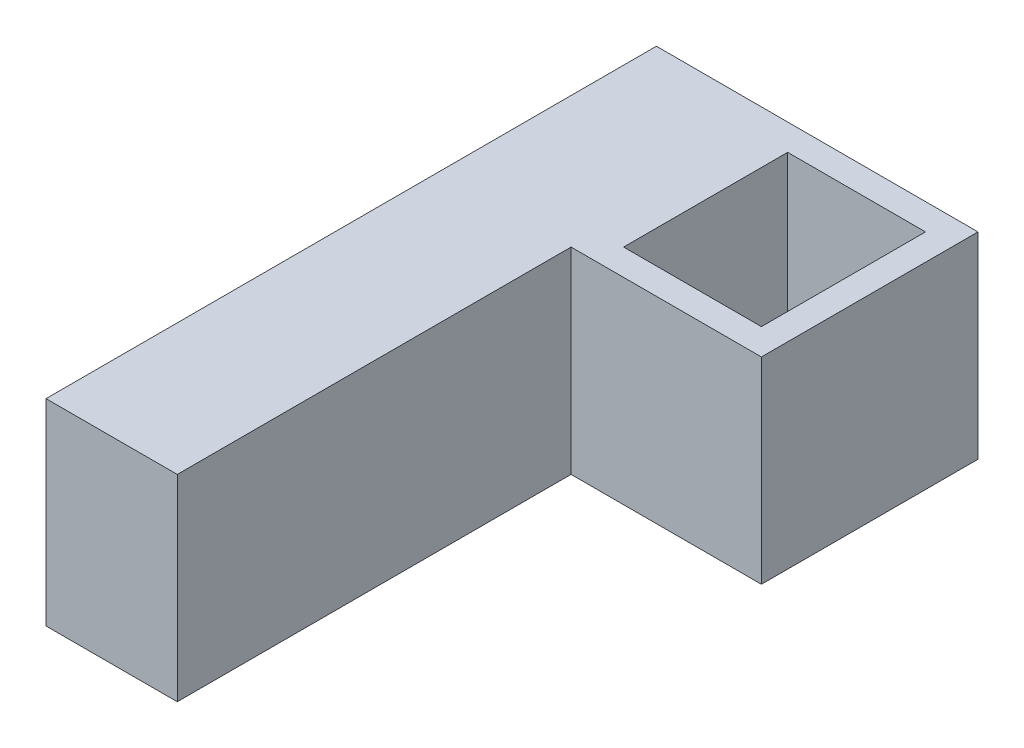
ISO-10303-21;
HEADER;
FILE_DESCRIPTION(('STEP AP214'),'2;1');
FILE_NAME('part.step','',(''),(''),'','','');
FILE_SCHEMA(('AUTOMOTIVE_DESIGN { 1 0 10303 214 1 1 1 1 }'));
ENDSEC;
DATA;
#1=APPLICATION_CONTEXT('core data for automotive mechanical design processes');
#2=APPLICATION_PROTOCOL_DEFINITION('international standard','automotive_design',2000,#1);
#3=PRODUCT_CONTEXT('',#1,'mechanical');
#4=PRODUCT('Part','Part','',(#3));
#5=PRODUCT_RELATED_PRODUCT_CATEGORY('part','',(#4));
#6=PRODUCT_DEFINITION_FORMATION('','',#4);
#7=PRODUCT_DEFINITION_CONTEXT('part definition',#1,'design');
#8=PRODUCT_DEFINITION('design','',#6,#7);
#9=PRODUCT_DEFINITION_SHAPE('','',#8);
#10=(LENGTH_UNIT() NAMED_UNIT(*) SI_UNIT(.MILLI.,.METRE.));
#11=(NAMED_UNIT(*) PLANE_ANGLE_UNIT() SI_UNIT($,.RADIAN.));
#12=(NAMED_UNIT(*) SI_UNIT($,.STERADIAN.) SOLID_ANGLE_UNIT());
#13=UNCERTAINTY_MEASURE_WITH_UNIT(LENGTH_MEASURE(1.E-05),#10,'distance_accuracy_value','');
#14=(GEOMETRIC_REPRESENTATION_CONTEXT(3) GLOBAL_UNCERTAINTY_ASSIGNED_CONTEXT((#13)) GLOBAL_UNIT_ASSIGNED_CONTEXT((#10,
#11,#12)) REPRESENTATION_CONTEXT('',''));
#15=CARTESIAN_POINT('',(0.,0.,0.));
#16=DIRECTION('',(0.,0.,1.));
#17=DIRECTION('',(1.,0.,0.));
#18=AXIS2_PLACEMENT_3D('',#15,#16,#17);
#19=CARTESIAN_POINT('',(0.,15.,0.));
#20=DIRECTION('',(0.,1.,0.));
#21=DIRECTION('',(0.,0.,1.));
#22=AXIS2_PLACEMENT_3D('',#19,#20,#21);
#23=PLANE('',#22);
#24=DIRECTION('',(-1.,0.,0.));
#25=VECTOR('',#24,1.);
#26=CARTESIAN_POINT('',(-2.,15.,-2.));
#27=LINE('',#26,#25);
#28=CARTESIAN_POINT('',(12.5,15.,-2.));
#29=VERTEX_POINT('',#28);
#30=CARTESIAN_POINT('',(-12.,15.,-2.));
#31=VERTEX_POINT('',#30);
#32=EDGE_CURVE('E165',#29,#31,#27,.T.);
#33=ORIENTED_EDGE('',*,*,#32,.T.);
#34=DIRECTION('',(0.,0.,1.));
#35=VECTOR('',#34,1.);
#36=CARTESIAN_POINT('',(-12.,15.,-2.));
#37=LINE('',#36,#35);
#38=CARTESIAN_POINT('',(-12.,15.,44.5));
#39=VERTEX_POINT('',#38);
#40=EDGE_CURVE('E169',#31,#39,#37,.T.);
#41=ORIENTED_EDGE('',*,*,#40,.T.);
#42=DIRECTION('',(1.,0.,0.));
#43=VECTOR('',#42,1.);
#44=CARTESIAN_POINT('',(-2.,15.,44.5));
#45=LINE('',#44,#43);
#46=CARTESIAN_POINT('',(-2.,15.,44.5));
#47=VERTEX_POINT('',#46);
#48=EDGE_CURVE('E173',#39,#47,#45,.T.);
#49=ORIENTED_EDGE('',*,*,#48,.T.);
#50=DIRECTION('',(0.,0.,-1.));
#51=VECTOR('',#50,1.);
#52=CARTESIAN_POINT('',(-2.,15.,14.5));
#53=LINE('',#52,#51);
#54=CARTESIAN_POINT('',(-2.,15.,14.5));
#55=VERTEX_POINT('',#54);
#56=EDGE_CURVE('E176',#47,#55,#53,.T.);
#57=ORIENTED_EDGE('',*,*,#56,.T.);
#58=DIRECTION('',(1.,0.,0.));
#59=VECTOR('',#58,1.);
#60=CARTESIAN_POINT('',(-2.,15.,14.5));
#61=LINE('',#60,#59);
#62=CARTESIAN_POINT('',(12.5,15.,14.5));
#63=VERTEX_POINT('',#62);
#64=EDGE_CURVE('E179',#55,#63,#61,.T.);
#65=ORIENTED_EDGE('',*,*,#64,.T.);
#66=DIRECTION('',(0.,0.,-1.));
#67=VECTOR('',#66,1.);
#68=CARTESIAN_POINT('',(12.5,15.,-2.));
#69=LINE('',#68,#67);
#70=EDGE_CURVE('E182',#63,#29,#69,.T.);
#71=ORIENTED_EDGE('',*,*,#70,.T.);
#72=EDGE_LOOP('',(#33,#41,#49,#57,#65,#71));
#73=FACE_BOUND('',#72,.T.);
#74=DIRECTION('',(1.,0.,0.));
#75=VECTOR('',#74,1.);
#76=CARTESIAN_POINT('',(0.,15.,12.5));
#77=LINE('',#76,#75);
#78=CARTESIAN_POINT('',(0.,15.,12.5));
#79=VERTEX_POINT('',#78);
#80=CARTESIAN_POINT('',(10.5,15.,12.5));
#81=VERTEX_POINT('',#80);
#82=EDGE_CURVE('E126',#79,#81,#77,.T.);
#83=ORIENTED_EDGE('',*,*,#82,.F.);
#84=DIRECTION('',(0.,0.,1.));
#85=VECTOR('',#84,1.);
#86=CARTESIAN_POINT('',(0.,15.,0.));
#87=LINE('',#86,#85);
#88=CARTESIAN_POINT('',(0.,15.,0.));
#89=VERTEX_POINT('',#88);
#90=EDGE_CURVE('E117',#89,#79,#87,.T.);
#91=ORIENTED_EDGE('',*,*,#90,.F.);
#92=DIRECTION('',(-1.,0.,0.));
#93=VECTOR('',#92,1.);
#94=CARTESIAN_POINT('',(0.,15.,0.));
#95=LINE('',#94,#93);
#96=CARTESIAN_POINT('',(10.5,15.,0.));
#97=VERTEX_POINT('',#96);
#98=EDGE_CURVE('E143',#97,#89,#95,.T.);
#99=ORIENTED_EDGE('',*,*,#98,.F.);
#100=DIRECTION('',(0.,0.,-1.));
#101=VECTOR('',#100,1.);
#102=CARTESIAN_POINT('',(10.5,15.,0.));
#103=LINE('',#102,#101);
#104=EDGE_CURVE('E139',#81,#97,#103,.T.);
#105=ORIENTED_EDGE('',*,*,#104,.F.);
#106=EDGE_LOOP('',(#83,#91,#99,#105));
#107=FACE_BOUND('',#106,.T.);
#108=ADVANCED_FACE('F39',(#73,#107),#23,.T.);
#109=CARTESIAN_POINT('',(0.,0.,0.));
#110=DIRECTION('',(0.,1.,0.));
#111=DIRECTION('',(0.,0.,1.));
#112=AXIS2_PLACEMENT_3D('',#109,#110,#111);
#113=PLANE('',#112);
#114=DIRECTION('',(0.,0.,1.));
#115=VECTOR('',#114,1.);
#116=CARTESIAN_POINT('',(-12.,0.,14.5));
#117=LINE('',#116,#115);
#118=CARTESIAN_POINT('',(-12.,0.,-2.));
#119=VERTEX_POINT('',#118);
#120=CARTESIAN_POINT('',(-12.,0.,44.5));
#121=VERTEX_POINT('',#120);
#122=EDGE_CURVE('E135',#119,#121,#117,.T.);
#123=ORIENTED_EDGE('',*,*,#122,.F.);
#124=DIRECTION('',(-1.,0.,0.));
#125=VECTOR('',#124,1.);
#126=CARTESIAN_POINT('',(-2.,0.,-2.));
#127=LINE('',#126,#125);
#128=CARTESIAN_POINT('',(12.5,0.,-2.));
#129=VERTEX_POINT('',#128);
#130=EDGE_CURVE('E170',#129,#119,#127,.T.);
#131=ORIENTED_EDGE('',*,*,#130,.F.);
#132=DIRECTION('',(0.,0.,-1.));
#133=VECTOR('',#132,1.);
#134=CARTESIAN_POINT('',(12.5,0.,-2.));
#135=LINE('',#134,#133);
#136=CARTESIAN_POINT('',(12.5,0.,14.5));
#137=VERTEX_POINT('',#136);
#138=EDGE_CURVE('E198',#137,#129,#135,.T.);
#139=ORIENTED_EDGE('',*,*,#138,.F.);
#140=DIRECTION('',(1.,0.,0.));
#141=VECTOR('',#140,1.);
#142=CARTESIAN_POINT('',(-2.,0.,14.5));
#143=LINE('',#142,#141);
#144=CARTESIAN_POINT('',(-2.,0.,14.5));
#145=VERTEX_POINT('',#144);
#146=EDGE_CURVE('E195',#145,#137,#143,.T.);
#147=ORIENTED_EDGE('',*,*,#146,.F.);
#148=DIRECTION('',(0.,0.,-1.));
#149=VECTOR('',#148,1.);
#150=CARTESIAN_POINT('',(-2.,0.,14.5));
#151=LINE('',#150,#149);
#152=CARTESIAN_POINT('',(-2.,0.,44.5));
#153=VERTEX_POINT('',#152);
#154=EDGE_CURVE('E192',#153,#145,#151,.T.);
#155=ORIENTED_EDGE('',*,*,#154,.F.);
#156=DIRECTION('',(1.,0.,0.));
#157=VECTOR('',#156,1.);
#158=CARTESIAN_POINT('',(-2.,0.,44.5));
#159=LINE('',#158,#157);
#160=EDGE_CURVE('E189',#121,#153,#159,.T.);
#161=ORIENTED_EDGE('',*,*,#160,.F.);
#162=EDGE_LOOP('',(#123,#131,#139,#147,#155,#161));
#163=FACE_BOUND('',#162,.T.);
#164=DIRECTION('',(0.,0.,1.));
#165=VECTOR('',#164,1.);
#166=CARTESIAN_POINT('',(0.,0.,0.));
#167=LINE('',#166,#165);
#168=CARTESIAN_POINT('',(0.,0.,0.));
#169=VERTEX_POINT('',#168);
#170=CARTESIAN_POINT('',(0.,0.,12.5));
#171=VERTEX_POINT('',#170);
#172=EDGE_CURVE('E63',#169,#171,#167,.T.);
#173=ORIENTED_EDGE('',*,*,#172,.T.);
#174=DIRECTION('',(1.,0.,0.));
#175=VECTOR('',#174,1.);
#176=CARTESIAN_POINT('',(0.,0.,12.5));
#177=LINE('',#176,#175);
#178=CARTESIAN_POINT('',(10.5,0.,12.5));
#179=VERTEX_POINT('',#178);
#180=EDGE_CURVE('E133',#171,#179,#177,.T.);
#181=ORIENTED_EDGE('',*,*,#180,.T.);
#182=DIRECTION('',(0.,0.,-1.));
#183=VECTOR('',#182,1.);
#184=CARTESIAN_POINT('',(10.5,0.,0.));
#185=LINE('',#184,#183);
#186=CARTESIAN_POINT('',(10.5,0.,0.));
#187=VERTEX_POINT('',#186);
#188=EDGE_CURVE('E152',#179,#187,#185,.T.);
#189=ORIENTED_EDGE('',*,*,#188,.T.);
#190=DIRECTION('',(-1.,0.,0.));
#191=VECTOR('',#190,1.);
#192=CARTESIAN_POINT('',(0.,0.,0.));
#193=LINE('',#192,#191);
#194=EDGE_CURVE('E127',#187,#169,#193,.T.);
#195=ORIENTED_EDGE('',*,*,#194,.T.);
#196=EDGE_LOOP('',(#173,#181,#189,#195));
#197=FACE_BOUND('',#196,.T.);
#198=ADVANCED_FACE('F229',(#163,#197),#113,.F.);
#199=CARTESIAN_POINT('',(-12.,15.,14.5));
#200=DIRECTION('',(1.,0.,0.));
#201=DIRECTION('',(0.,0.,-1.));
#202=AXIS2_PLACEMENT_3D('',#199,#200,#201);
#203=PLANE('',#202);
#204=ORIENTED_EDGE('',*,*,#122,.T.);
#205=DIRECTION('',(0.,-1.,0.));
#206=VECTOR('',#205,1.);
#207=CARTESIAN_POINT('',(-12.,15.,44.5));
#208=LINE('',#207,#206);
#209=EDGE_CURVE('E48',#39,#121,#208,.T.);
#210=ORIENTED_EDGE('',*,*,#209,.F.);
#211=ORIENTED_EDGE('',*,*,#40,.F.);
#212=DIRECTION('',(0.,-1.,0.));
#213=VECTOR('',#212,1.);
#214=CARTESIAN_POINT('',(-12.,15.,-2.));
#215=LINE('',#214,#213);
#216=EDGE_CURVE('E11',#31,#119,#215,.T.);
#217=ORIENTED_EDGE('',*,*,#216,.T.);
#218=EDGE_LOOP('',(#204,#210,#211,#217));
#219=FACE_BOUND('',#218,.T.);
#220=ADVANCED_FACE('F41',(#219),#203,.F.);
#221=CARTESIAN_POINT('',(-2.,15.,44.5));
#222=DIRECTION('',(0.,0.,-1.));
#223=DIRECTION('',(-1.,0.,0.));
#224=AXIS2_PLACEMENT_3D('',#221,#222,#223);
#225=PLANE('',#224);
#226=ORIENTED_EDGE('',*,*,#160,.T.);
#227=DIRECTION('',(0.,-1.,0.));
#228=VECTOR('',#227,1.);
#229=CARTESIAN_POINT('',(-2.,15.,44.5));
#230=LINE('',#229,#228);
#231=EDGE_CURVE('E215',#47,#153,#230,.T.);
#232=ORIENTED_EDGE('',*,*,#231,.F.);
#233=ORIENTED_EDGE('',*,*,#48,.F.);
#234=ORIENTED_EDGE('',*,*,#209,.T.);
#235=EDGE_LOOP('',(#226,#232,#233,#234));
#236=FACE_BOUND('',#235,.T.);
#237=ADVANCED_FACE('F224',(#236),#225,.F.);
#238=CARTESIAN_POINT('',(-2.,15.,14.5));
#239=DIRECTION('',(-1.,0.,0.));
#240=DIRECTION('',(0.,0.,1.));
#241=AXIS2_PLACEMENT_3D('',#238,#239,#240);
#242=PLANE('',#241);
#243=ORIENTED_EDGE('',*,*,#154,.T.);
#244=DIRECTION('',(0.,-1.,0.));
#245=VECTOR('',#244,1.);
#246=CARTESIAN_POINT('',(-2.,15.,14.5));
#247=LINE('',#246,#245);
#248=EDGE_CURVE('E211',#55,#145,#247,.T.);
#249=ORIENTED_EDGE('',*,*,#248,.F.);
#250=ORIENTED_EDGE('',*,*,#56,.F.);
#251=ORIENTED_EDGE('',*,*,#231,.T.);
#252=EDGE_LOOP('',(#243,#249,#250,#251));
#253=FACE_BOUND('',#252,.T.);
#254=ADVANCED_FACE('F236',(#253),#242,.F.);
#255=CARTESIAN_POINT('',(-2.,15.,14.5));
#256=DIRECTION('',(0.,0.,-1.));
#257=DIRECTION('',(-1.,0.,0.));
#258=AXIS2_PLACEMENT_3D('',#255,#256,#257);
#259=PLANE('',#258);
#260=ORIENTED_EDGE('',*,*,#146,.T.);
#261=DIRECTION('',(0.,-1.,0.));
#262=VECTOR('',#261,1.);
#263=CARTESIAN_POINT('',(12.5,15.,14.5));
#264=LINE('',#263,#262);
#265=EDGE_CURVE('E207',#63,#137,#264,.T.);
#266=ORIENTED_EDGE('',*,*,#265,.F.);
#267=ORIENTED_EDGE('',*,*,#64,.F.);
#268=ORIENTED_EDGE('',*,*,#248,.T.);
#269=EDGE_LOOP('',(#260,#266,#267,#268));
#270=FACE_BOUND('',#269,.T.);
#271=ADVANCED_FACE('F240',(#270),#259,.F.);
#272=CARTESIAN_POINT('',(12.5,15.,-2.));
#273=DIRECTION('',(-1.,0.,0.));
#274=DIRECTION('',(0.,0.,1.));
#275=AXIS2_PLACEMENT_3D('',#272,#273,#274);
#276=PLANE('',#275);
#277=ORIENTED_EDGE('',*,*,#138,.T.);
#278=DIRECTION('',(0.,-1.,0.));
#279=VECTOR('',#278,1.);
#280=CARTESIAN_POINT('',(12.5,15.,-2.));
#281=LINE('',#280,#279);
#282=EDGE_CURVE('E186',#29,#129,#281,.T.);
#283=ORIENTED_EDGE('',*,*,#282,.F.);
#284=ORIENTED_EDGE('',*,*,#70,.F.);
#285=ORIENTED_EDGE('',*,*,#265,.T.);
#286=EDGE_LOOP('',(#277,#283,#284,#285));
#287=FACE_BOUND('',#286,.T.);
#288=ADVANCED_FACE('F249',(#287),#276,.F.);
#289=CARTESIAN_POINT('',(-2.,15.,-2.));
#290=DIRECTION('',(0.,0.,1.));
#291=DIRECTION('',(1.,0.,0.));
#292=AXIS2_PLACEMENT_3D('',#289,#290,#291);
#293=PLANE('',#292);
#294=ORIENTED_EDGE('',*,*,#130,.T.);
#295=ORIENTED_EDGE('',*,*,#216,.F.);
#296=ORIENTED_EDGE('',*,*,#32,.F.);
#297=ORIENTED_EDGE('',*,*,#282,.T.);
#298=EDGE_LOOP('',(#294,#295,#296,#297));
#299=FACE_BOUND('',#298,.T.);
#300=ADVANCED_FACE('F247',(#299),#293,.F.);
#301=CARTESIAN_POINT('',(0.,15.,0.));
#302=DIRECTION('',(1.,0.,0.));
#303=DIRECTION('',(0.,0.,-1.));
#304=AXIS2_PLACEMENT_3D('',#301,#302,#303);
#305=PLANE('',#304);
#306=ORIENTED_EDGE('',*,*,#172,.F.);
#307=DIRECTION('',(0.,-1.,0.));
#308=VECTOR('',#307,1.);
#309=CARTESIAN_POINT('',(0.,15.,0.));
#310=LINE('',#309,#308);
#311=EDGE_CURVE('E121',#89,#169,#310,.T.);
#312=ORIENTED_EDGE('',*,*,#311,.F.);
#313=ORIENTED_EDGE('',*,*,#90,.T.);
#314=DIRECTION('',(0.,-1.,0.));
#315=VECTOR('',#314,1.);
#316=CARTESIAN_POINT('',(0.,15.,12.5));
#317=LINE('',#316,#315);
#318=EDGE_CURVE('E120',#79,#171,#317,.T.);
#319=ORIENTED_EDGE('',*,*,#318,.T.);
#320=EDGE_LOOP('',(#306,#312,#313,#319));
#321=FACE_BOUND('',#320,.T.);
#322=ADVANCED_FACE('F119',(#321),#305,.T.);
#323=CARTESIAN_POINT('',(0.,15.,12.5));
#324=DIRECTION('',(0.,0.,-1.));
#325=DIRECTION('',(-1.,0.,0.));
#326=AXIS2_PLACEMENT_3D('',#323,#324,#325);
#327=PLANE('',#326);
#328=ORIENTED_EDGE('',*,*,#180,.F.);
#329=ORIENTED_EDGE('',*,*,#318,.F.);
#330=ORIENTED_EDGE('',*,*,#82,.T.);
#331=DIRECTION('',(0.,-1.,0.));
#332=VECTOR('',#331,1.);
#333=CARTESIAN_POINT('',(10.5,15.,12.5));
#334=LINE('',#333,#332);
#335=EDGE_CURVE('E136',#81,#179,#334,.T.);
#336=ORIENTED_EDGE('',*,*,#335,.T.);
#337=EDGE_LOOP('',(#328,#329,#330,#336));
#338=FACE_BOUND('',#337,.T.);
#339=ADVANCED_FACE('F130',(#338),#327,.T.);
#340=CARTESIAN_POINT('',(10.5,15.,0.));
#341=DIRECTION('',(-1.,0.,0.));
#342=DIRECTION('',(0.,0.,1.));
#343=AXIS2_PLACEMENT_3D('',#340,#341,#342);
#344=PLANE('',#343);
#345=ORIENTED_EDGE('',*,*,#188,.F.);
#346=ORIENTED_EDGE('',*,*,#335,.F.);
#347=ORIENTED_EDGE('',*,*,#104,.T.);
#348=DIRECTION('',(0.,-1.,0.));
#349=VECTOR('',#348,1.);
#350=CARTESIAN_POINT('',(10.5,15.,0.));
#351=LINE('',#350,#349);
#352=EDGE_CURVE('E55',#97,#187,#351,.T.);
#353=ORIENTED_EDGE('',*,*,#352,.T.);
#354=EDGE_LOOP('',(#345,#346,#347,#353));
#355=FACE_BOUND('',#354,.T.);
#356=ADVANCED_FACE('F269',(#355),#344,.T.);
#357=CARTESIAN_POINT('',(0.,15.,0.));
#358=DIRECTION('',(0.,0.,1.));
#359=DIRECTION('',(1.,0.,0.));
#360=AXIS2_PLACEMENT_3D('',#357,#358,#359);
#361=PLANE('',#360);
#362=ORIENTED_EDGE('',*,*,#194,.F.);
#363=ORIENTED_EDGE('',*,*,#352,.F.);
#364=ORIENTED_EDGE('',*,*,#98,.T.);
#365=ORIENTED_EDGE('',*,*,#311,.T.);
#366=EDGE_LOOP('',(#362,#363,#364,#365));
#367=FACE_BOUND('',#366,.T.);
#368=ADVANCED_FACE('F272',(#367),#361,.T.);
#369=CLOSED_SHELL('',(#108,#198,#220,#237,#254,#271,#288,#300,#322,#339,#356,#368));
#370=MANIFOLD_SOLID_BREP('B2',#369);
#371=ADVANCED_BREP_SHAPE_REPRESENTATION('',(#18,#370),#14);
#372=SHAPE_DEFINITION_REPRESENTATION(#9,#371);
ENDSEC;
END-ISO-10303-21;
